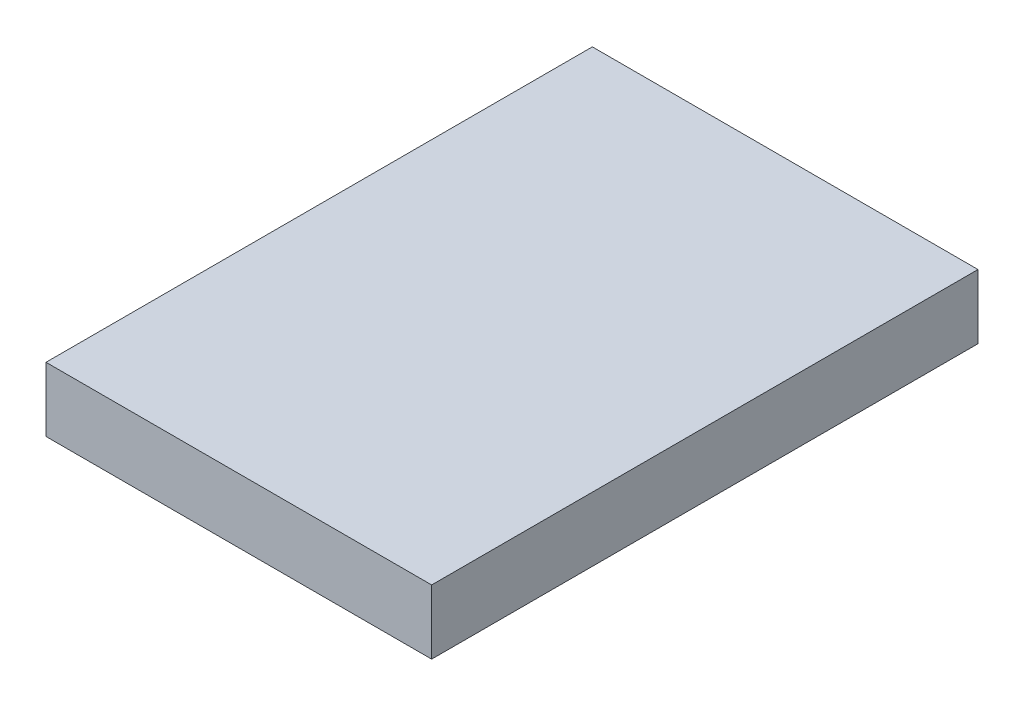
ISO-10303-21;
HEADER;
FILE_DESCRIPTION(('STEP AP214'),'2;1');
FILE_NAME('part.step','',(''),(''),'','','');
FILE_SCHEMA(('AUTOMOTIVE_DESIGN { 1 0 10303 214 1 1 1 1 }'));
ENDSEC;
DATA;
#1=APPLICATION_CONTEXT('core data for automotive mechanical design processes');
#2=APPLICATION_PROTOCOL_DEFINITION('international standard','automotive_design',2000,#1);
#3=PRODUCT_CONTEXT('',#1,'mechanical');
#4=PRODUCT('Part','Part','',(#3));
#5=PRODUCT_RELATED_PRODUCT_CATEGORY('part','',(#4));
#6=PRODUCT_DEFINITION_FORMATION('','',#4);
#7=PRODUCT_DEFINITION_CONTEXT('part definition',#1,'design');
#8=PRODUCT_DEFINITION('design','',#6,#7);
#9=PRODUCT_DEFINITION_SHAPE('','',#8);
#10=(LENGTH_UNIT() NAMED_UNIT(*) SI_UNIT(.MILLI.,.METRE.));
#11=(NAMED_UNIT(*) PLANE_ANGLE_UNIT() SI_UNIT($,.RADIAN.));
#12=(NAMED_UNIT(*) SI_UNIT($,.STERADIAN.) SOLID_ANGLE_UNIT());
#13=UNCERTAINTY_MEASURE_WITH_UNIT(LENGTH_MEASURE(1.E-05),#10,'distance_accuracy_value','');
#14=(GEOMETRIC_REPRESENTATION_CONTEXT(3) GLOBAL_UNCERTAINTY_ASSIGNED_CONTEXT((#13)) GLOBAL_UNIT_ASSIGNED_CONTEXT((#10,
#11,#12)) REPRESENTATION_CONTEXT('',''));
#15=CARTESIAN_POINT('',(0.,0.,0.));
#16=DIRECTION('',(0.,0.,1.));
#17=DIRECTION('',(1.,0.,0.));
#18=AXIS2_PLACEMENT_3D('',#15,#16,#17);
#19=CARTESIAN_POINT('',(30.,5.,85.));
#20=DIRECTION('',(-1.,0.,0.));
#21=DIRECTION('',(0.,-1.,0.));
#22=AXIS2_PLACEMENT_3D('',#19,#20,#21);
#23=PLANE('',#22);
#24=DIRECTION('',(0.,1.,0.));
#25=VECTOR('',#24,1.);
#26=CARTESIAN_POINT('',(30.,5.,0.));
#27=LINE('',#26,#25);
#28=CARTESIAN_POINT('',(30.,-5.,0.));
#29=VERTEX_POINT('',#28);
#30=CARTESIAN_POINT('',(30.,5.,0.));
#31=VERTEX_POINT('',#30);
#32=EDGE_CURVE('E111',#29,#31,#27,.T.);
#33=ORIENTED_EDGE('',*,*,#32,.T.);
#34=DIRECTION('',(0.,0.,-1.));
#35=VECTOR('',#34,1.);
#36=CARTESIAN_POINT('',(30.,5.,85.));
#37=LINE('',#36,#35);
#38=CARTESIAN_POINT('',(30.,5.,85.));
#39=VERTEX_POINT('',#38);
#40=EDGE_CURVE('E11',#39,#31,#37,.T.);
#41=ORIENTED_EDGE('',*,*,#40,.F.);
#42=DIRECTION('',(0.,1.,0.));
#43=VECTOR('',#42,1.);
#44=CARTESIAN_POINT('',(30.,5.,85.));
#45=LINE('',#44,#43);
#46=CARTESIAN_POINT('',(30.,-5.,85.));
#47=VERTEX_POINT('',#46);
#48=EDGE_CURVE('E95',#47,#39,#45,.T.);
#49=ORIENTED_EDGE('',*,*,#48,.F.);
#50=DIRECTION('',(0.,0.,-1.));
#51=VECTOR('',#50,1.);
#52=CARTESIAN_POINT('',(30.,-5.,85.));
#53=LINE('',#52,#51);
#54=EDGE_CURVE('E107',#47,#29,#53,.T.);
#55=ORIENTED_EDGE('',*,*,#54,.T.);
#56=EDGE_LOOP('',(#33,#41,#49,#55));
#57=FACE_BOUND('',#56,.T.);
#58=ADVANCED_FACE('F43',(#57),#23,.F.);
#59=CARTESIAN_POINT('',(-30.,5.,85.));
#60=DIRECTION('',(0.,-1.,0.));
#61=DIRECTION('',(0.,0.,-1.));
#62=AXIS2_PLACEMENT_3D('',#59,#60,#61);
#63=PLANE('',#62);
#64=DIRECTION('',(-1.,0.,0.));
#65=VECTOR('',#64,1.);
#66=CARTESIAN_POINT('',(-30.,5.,0.));
#67=LINE('',#66,#65);
#68=CARTESIAN_POINT('',(-30.,5.,0.));
#69=VERTEX_POINT('',#68);
#70=EDGE_CURVE('E100',#31,#69,#67,.T.);
#71=ORIENTED_EDGE('',*,*,#70,.T.);
#72=DIRECTION('',(0.,0.,-1.));
#73=VECTOR('',#72,1.);
#74=CARTESIAN_POINT('',(-30.,5.,85.));
#75=LINE('',#74,#73);
#76=CARTESIAN_POINT('',(-30.,5.,85.));
#77=VERTEX_POINT('',#76);
#78=EDGE_CURVE('E52',#77,#69,#75,.T.);
#79=ORIENTED_EDGE('',*,*,#78,.F.);
#80=DIRECTION('',(-1.,0.,0.));
#81=VECTOR('',#80,1.);
#82=CARTESIAN_POINT('',(-30.,5.,85.));
#83=LINE('',#82,#81);
#84=EDGE_CURVE('E90',#39,#77,#83,.T.);
#85=ORIENTED_EDGE('',*,*,#84,.F.);
#86=ORIENTED_EDGE('',*,*,#40,.T.);
#87=EDGE_LOOP('',(#71,#79,#85,#86));
#88=FACE_BOUND('',#87,.T.);
#89=ADVANCED_FACE('F99',(#88),#63,.F.);
#90=CARTESIAN_POINT('',(-30.,5.,85.));
#91=DIRECTION('',(1.,0.,0.));
#92=DIRECTION('',(0.,0.,-1.));
#93=AXIS2_PLACEMENT_3D('',#90,#91,#92);
#94=PLANE('',#93);
#95=DIRECTION('',(0.,-1.,0.));
#96=VECTOR('',#95,1.);
#97=CARTESIAN_POINT('',(-30.,5.,0.));
#98=LINE('',#97,#96);
#99=CARTESIAN_POINT('',(-30.,-5.,0.));
#100=VERTEX_POINT('',#99);
#101=EDGE_CURVE('E77',#69,#100,#98,.T.);
#102=ORIENTED_EDGE('',*,*,#101,.T.);
#103=DIRECTION('',(0.,0.,-1.));
#104=VECTOR('',#103,1.);
#105=CARTESIAN_POINT('',(-30.,-5.,85.));
#106=LINE('',#105,#104);
#107=CARTESIAN_POINT('',(-30.,-5.,85.));
#108=VERTEX_POINT('',#107);
#109=EDGE_CURVE('E102',#108,#100,#106,.T.);
#110=ORIENTED_EDGE('',*,*,#109,.F.);
#111=DIRECTION('',(0.,-1.,0.));
#112=VECTOR('',#111,1.);
#113=CARTESIAN_POINT('',(-30.,5.,85.));
#114=LINE('',#113,#112);
#115=EDGE_CURVE('E93',#77,#108,#114,.T.);
#116=ORIENTED_EDGE('',*,*,#115,.F.);
#117=ORIENTED_EDGE('',*,*,#78,.T.);
#118=EDGE_LOOP('',(#102,#110,#116,#117));
#119=FACE_BOUND('',#118,.T.);
#120=ADVANCED_FACE('F103',(#119),#94,.F.);
#121=CARTESIAN_POINT('',(-30.,-5.,85.));
#122=DIRECTION('',(0.,1.,0.));
#123=DIRECTION('',(0.,0.,1.));
#124=AXIS2_PLACEMENT_3D('',#121,#122,#123);
#125=PLANE('',#124);
#126=DIRECTION('',(1.,0.,0.));
#127=VECTOR('',#126,1.);
#128=CARTESIAN_POINT('',(-30.,-5.,0.));
#129=LINE('',#128,#127);
#130=EDGE_CURVE('E83',#100,#29,#129,.T.);
#131=ORIENTED_EDGE('',*,*,#130,.T.);
#132=ORIENTED_EDGE('',*,*,#54,.F.);
#133=DIRECTION('',(1.,0.,0.));
#134=VECTOR('',#133,1.);
#135=CARTESIAN_POINT('',(-30.,-5.,85.));
#136=LINE('',#135,#134);
#137=EDGE_CURVE('E60',#108,#47,#136,.T.);
#138=ORIENTED_EDGE('',*,*,#137,.F.);
#139=ORIENTED_EDGE('',*,*,#109,.T.);
#140=EDGE_LOOP('',(#131,#132,#138,#139));
#141=FACE_BOUND('',#140,.T.);
#142=ADVANCED_FACE('F124',(#141),#125,.F.);
#143=CARTESIAN_POINT('',(0.,0.,85.));
#144=DIRECTION('',(0.,0.,1.));
#145=DIRECTION('',(1.,0.,0.));
#146=AXIS2_PLACEMENT_3D('',#143,#144,#145);
#147=PLANE('',#146);
#148=ORIENTED_EDGE('',*,*,#48,.T.);
#149=ORIENTED_EDGE('',*,*,#84,.T.);
#150=ORIENTED_EDGE('',*,*,#115,.T.);
#151=ORIENTED_EDGE('',*,*,#137,.T.);
#152=EDGE_LOOP('',(#148,#149,#150,#151));
#153=FACE_BOUND('',#152,.T.);
#154=ADVANCED_FACE('F91',(#153),#147,.T.);
#155=CARTESIAN_POINT('',(0.,0.,0.));
#156=DIRECTION('',(0.,0.,1.));
#157=DIRECTION('',(1.,0.,0.));
#158=AXIS2_PLACEMENT_3D('',#155,#156,#157);
#159=PLANE('',#158);
#160=ORIENTED_EDGE('',*,*,#32,.F.);
#161=ORIENTED_EDGE('',*,*,#130,.F.);
#162=ORIENTED_EDGE('',*,*,#101,.F.);
#163=ORIENTED_EDGE('',*,*,#70,.F.);
#164=EDGE_LOOP('',(#160,#161,#162,#163));
#165=FACE_BOUND('',#164,.T.);
#166=ADVANCED_FACE('F127',(#165),#159,.F.);
#167=CLOSED_SHELL('',(#58,#89,#120,#142,#154,#166));
#168=MANIFOLD_SOLID_BREP('B2',#167);
#169=ADVANCED_BREP_SHAPE_REPRESENTATION('',(#18,#168),#14);
#170=SHAPE_DEFINITION_REPRESENTATION(#9,#169);
ENDSEC;
END-ISO-10303-21;
